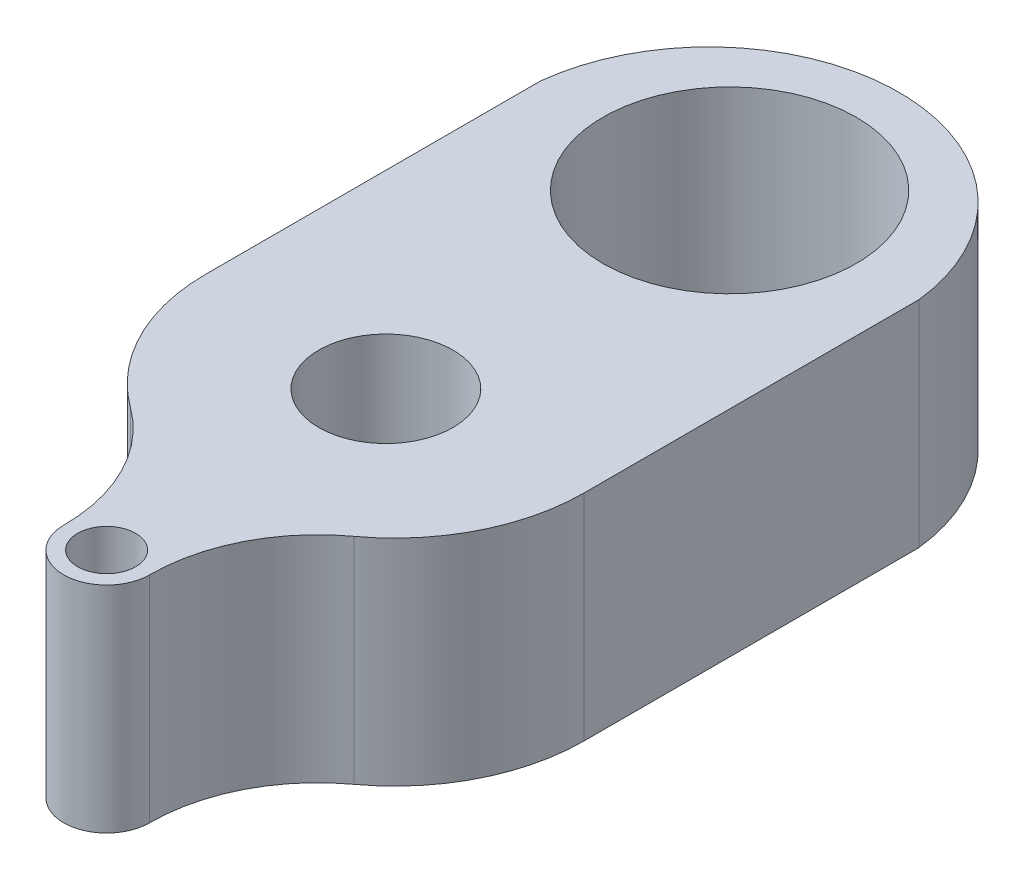
ISO-10303-21;
HEADER;
FILE_DESCRIPTION(('STEP AP214'),'2;1');
FILE_NAME('part.step','',(''),(''),'','','');
FILE_SCHEMA(('AUTOMOTIVE_DESIGN { 1 0 10303 214 1 1 1 1 }'));
ENDSEC;
DATA;
#1=APPLICATION_CONTEXT('core data for automotive mechanical design processes');
#2=APPLICATION_PROTOCOL_DEFINITION('international standard','automotive_design',2000,#1);
#3=PRODUCT_CONTEXT('',#1,'mechanical');
#4=PRODUCT('Part','Part','',(#3));
#5=PRODUCT_RELATED_PRODUCT_CATEGORY('part','',(#4));
#6=PRODUCT_DEFINITION_FORMATION('','',#4);
#7=PRODUCT_DEFINITION_CONTEXT('part definition',#1,'design');
#8=PRODUCT_DEFINITION('design','',#6,#7);
#9=PRODUCT_DEFINITION_SHAPE('','',#8);
#10=(LENGTH_UNIT() NAMED_UNIT(*) SI_UNIT(.MILLI.,.METRE.));
#11=(NAMED_UNIT(*) PLANE_ANGLE_UNIT() SI_UNIT($,.RADIAN.));
#12=(NAMED_UNIT(*) SI_UNIT($,.STERADIAN.) SOLID_ANGLE_UNIT());
#13=UNCERTAINTY_MEASURE_WITH_UNIT(LENGTH_MEASURE(1.E-05),#10,'distance_accuracy_value','');
#14=(GEOMETRIC_REPRESENTATION_CONTEXT(3) GLOBAL_UNCERTAINTY_ASSIGNED_CONTEXT((#13)) GLOBAL_UNIT_ASSIGNED_CONTEXT((#10,
#11,#12)) REPRESENTATION_CONTEXT('',''));
#15=CARTESIAN_POINT('',(0.,0.,0.));
#16=DIRECTION('',(0.,0.,1.));
#17=DIRECTION('',(1.,0.,0.));
#18=AXIS2_PLACEMENT_3D('',#15,#16,#17);
#19=CARTESIAN_POINT('',(0.,1.27,-1.70438291046017));
#20=DIRECTION('',(0.,-1.,0.));
#21=DIRECTION('',(0.,0.,-1.));
#22=AXIS2_PLACEMENT_3D('',#19,#20,#21);
#23=CYLINDRICAL_SURFACE('',#22,1.11918749999999);
#24=CARTESIAN_POINT('',(0.,0.,-1.70438291046017));
#25=DIRECTION('',(0.,1.,0.));
#26=DIRECTION('',(0.,0.,1.));
#27=AXIS2_PLACEMENT_3D('',#24,#25,#26);
#28=CIRCLE('',#27,1.11918749999999);
#29=CARTESIAN_POINT('',(-1.11918749999999,0.,-1.70438291046017));
#30=VERTEX_POINT('',#29);
#31=CARTESIAN_POINT('',(-0.660573073308267,0.,-0.800931818825275));
#32=VERTEX_POINT('',#31);
#33=EDGE_CURVE('E143',#30,#32,#28,.T.);
#34=ORIENTED_EDGE('',*,*,#33,.T.);
#35=DIRECTION('',(0.,-1.,0.));
#36=VECTOR('',#35,1.);
#37=CARTESIAN_POINT('',(-0.660573073308267,1.27,-0.800931818825275));
#38=LINE('',#37,#36);
#39=CARTESIAN_POINT('',(-0.660573073308267,1.27,-0.800931818825275));
#40=VERTEX_POINT('',#39);
#41=EDGE_CURVE('E11',#40,#32,#38,.T.);
#42=ORIENTED_EDGE('',*,*,#41,.F.);
#43=CARTESIAN_POINT('',(0.,1.27,-1.70438291046017));
#44=DIRECTION('',(0.,1.,0.));
#45=DIRECTION('',(0.,0.,1.));
#46=AXIS2_PLACEMENT_3D('',#43,#44,#45);
#47=CIRCLE('',#46,1.11918749999999);
#48=CARTESIAN_POINT('',(-1.11918749999999,1.27,-1.70438291046017));
#49=VERTEX_POINT('',#48);
#50=EDGE_CURVE('E189',#49,#40,#47,.T.);
#51=ORIENTED_EDGE('',*,*,#50,.F.);
#52=DIRECTION('',(0.,-1.,0.));
#53=VECTOR('',#52,1.);
#54=CARTESIAN_POINT('',(-1.11918749999999,1.27,-1.70438291046017));
#55=LINE('',#54,#53);
#56=EDGE_CURVE('E136',#49,#30,#55,.T.);
#57=ORIENTED_EDGE('',*,*,#56,.T.);
#58=EDGE_LOOP('',(#34,#42,#51,#57));
#59=FACE_BOUND('',#58,.T.);
#60=ADVANCED_FACE('F34',(#59),#23,.T.);
#61=CARTESIAN_POINT('',(-1.2461875,1.27,0.));
#62=DIRECTION('',(0.,-1.,0.));
#63=DIRECTION('',(0.,0.,-1.));
#64=AXIS2_PLACEMENT_3D('',#61,#62,#63);
#65=CYLINDRICAL_SURFACE('',#64,0.9921875);
#66=CARTESIAN_POINT('',(-1.2461875,0.,0.));
#67=DIRECTION('',(0.,1.,0.));
#68=DIRECTION('',(0.,0.,1.));
#69=AXIS2_PLACEMENT_3D('',#66,#67,#68);
#70=CIRCLE('',#69,0.9921875);
#71=CARTESIAN_POINT('',(-0.254,0.,0.));
#72=VERTEX_POINT('',#71);
#73=EDGE_CURVE('E146',#32,#72,#70,.F.);
#74=ORIENTED_EDGE('',*,*,#73,.T.);
#75=DIRECTION('',(0.,-1.,0.));
#76=VECTOR('',#75,1.);
#77=CARTESIAN_POINT('',(-0.254,1.27,0.));
#78=LINE('',#77,#76);
#79=CARTESIAN_POINT('',(-0.254,1.27,0.));
#80=VERTEX_POINT('',#79);
#81=EDGE_CURVE('E43',#80,#72,#78,.T.);
#82=ORIENTED_EDGE('',*,*,#81,.F.);
#83=CARTESIAN_POINT('',(-1.2461875,1.27,0.));
#84=DIRECTION('',(0.,1.,0.));
#85=DIRECTION('',(0.,0.,1.));
#86=AXIS2_PLACEMENT_3D('',#83,#84,#85);
#87=CIRCLE('',#86,0.9921875);
#88=EDGE_CURVE('E93',#40,#80,#87,.F.);
#89=ORIENTED_EDGE('',*,*,#88,.F.);
#90=ORIENTED_EDGE('',*,*,#41,.T.);
#91=EDGE_LOOP('',(#74,#82,#89,#90));
#92=FACE_BOUND('',#91,.T.);
#93=ADVANCED_FACE('F218',(#92),#65,.F.);
#94=CARTESIAN_POINT('',(0.,1.27,0.));
#95=DIRECTION('',(0.,-1.,0.));
#96=DIRECTION('',(0.,0.,-1.));
#97=AXIS2_PLACEMENT_3D('',#94,#95,#96);
#98=CYLINDRICAL_SURFACE('',#97,0.254);
#99=CARTESIAN_POINT('',(0.,0.,0.));
#100=DIRECTION('',(0.,1.,0.));
#101=DIRECTION('',(0.,0.,1.));
#102=AXIS2_PLACEMENT_3D('',#99,#100,#101);
#103=CIRCLE('',#102,0.254);
#104=CARTESIAN_POINT('',(0.254,0.,0.));
#105=VERTEX_POINT('',#104);
#106=EDGE_CURVE('E148',#72,#105,#103,.T.);
#107=ORIENTED_EDGE('',*,*,#106,.T.);
#108=DIRECTION('',(0.,-1.,0.));
#109=VECTOR('',#108,1.);
#110=CARTESIAN_POINT('',(0.254,1.27,0.));
#111=LINE('',#110,#109);
#112=CARTESIAN_POINT('',(0.254,1.27,0.));
#113=VERTEX_POINT('',#112);
#114=EDGE_CURVE('E169',#113,#105,#111,.T.);
#115=ORIENTED_EDGE('',*,*,#114,.F.);
#116=CARTESIAN_POINT('',(0.,1.27,0.));
#117=DIRECTION('',(0.,1.,0.));
#118=DIRECTION('',(0.,0.,1.));
#119=AXIS2_PLACEMENT_3D('',#116,#117,#118);
#120=CIRCLE('',#119,0.254);
#121=EDGE_CURVE('E176',#80,#113,#120,.T.);
#122=ORIENTED_EDGE('',*,*,#121,.F.);
#123=ORIENTED_EDGE('',*,*,#81,.T.);
#124=EDGE_LOOP('',(#107,#115,#122,#123));
#125=FACE_BOUND('',#124,.T.);
#126=ADVANCED_FACE('F174',(#125),#98,.T.);
#127=CARTESIAN_POINT('',(1.2461875,1.27,0.));
#128=DIRECTION('',(0.,-1.,0.));
#129=DIRECTION('',(0.,0.,-1.));
#130=AXIS2_PLACEMENT_3D('',#127,#128,#129);
#131=CYLINDRICAL_SURFACE('',#130,0.9921875);
#132=CARTESIAN_POINT('',(1.2461875,0.,0.));
#133=DIRECTION('',(0.,1.,0.));
#134=DIRECTION('',(0.,0.,1.));
#135=AXIS2_PLACEMENT_3D('',#132,#133,#134);
#136=CIRCLE('',#135,0.9921875);
#137=CARTESIAN_POINT('',(0.660573073308267,0.,-0.800931818825275));
#138=VERTEX_POINT('',#137);
#139=EDGE_CURVE('E151',#138,#105,#136,.T.);
#140=ORIENTED_EDGE('',*,*,#139,.F.);
#141=DIRECTION('',(0.,-1.,0.));
#142=VECTOR('',#141,1.);
#143=CARTESIAN_POINT('',(0.660573073308267,1.27,-0.800931818825275));
#144=LINE('',#143,#142);
#145=CARTESIAN_POINT('',(0.660573073308267,1.27,-0.800931818825275));
#146=VERTEX_POINT('',#145);
#147=EDGE_CURVE('E167',#146,#138,#144,.T.);
#148=ORIENTED_EDGE('',*,*,#147,.F.);
#149=CARTESIAN_POINT('',(1.2461875,1.27,0.));
#150=DIRECTION('',(0.,1.,0.));
#151=DIRECTION('',(0.,0.,1.));
#152=AXIS2_PLACEMENT_3D('',#149,#150,#151);
#153=CIRCLE('',#152,0.9921875);
#154=EDGE_CURVE('E128',#146,#113,#153,.T.);
#155=ORIENTED_EDGE('',*,*,#154,.T.);
#156=ORIENTED_EDGE('',*,*,#114,.T.);
#157=EDGE_LOOP('',(#140,#148,#155,#156));
#158=FACE_BOUND('',#157,.T.);
#159=ADVANCED_FACE('F184',(#158),#131,.F.);
#160=CARTESIAN_POINT('',(0.,1.27,-1.70438291046017));
#161=DIRECTION('',(0.,-1.,0.));
#162=DIRECTION('',(0.,0.,-1.));
#163=AXIS2_PLACEMENT_3D('',#160,#161,#162);
#164=CYLINDRICAL_SURFACE('',#163,1.11918749999999);
#165=CARTESIAN_POINT('',(0.,0.,-1.70438291046017));
#166=DIRECTION('',(0.,1.,0.));
#167=DIRECTION('',(0.,0.,1.));
#168=AXIS2_PLACEMENT_3D('',#165,#166,#167);
#169=CIRCLE('',#168,1.11918749999999);
#170=CARTESIAN_POINT('',(1.11918749999999,0.,-1.70438291046017));
#171=VERTEX_POINT('',#170);
#172=EDGE_CURVE('E154',#171,#138,#169,.F.);
#173=ORIENTED_EDGE('',*,*,#172,.F.);
#174=DIRECTION('',(0.,-1.,0.));
#175=VECTOR('',#174,1.);
#176=CARTESIAN_POINT('',(1.11918749999999,1.27,-1.70438291046017));
#177=LINE('',#176,#175);
#178=CARTESIAN_POINT('',(1.11918749999999,1.27,-1.70438291046017));
#179=VERTEX_POINT('',#178);
#180=EDGE_CURVE('E115',#179,#171,#177,.T.);
#181=ORIENTED_EDGE('',*,*,#180,.F.);
#182=CARTESIAN_POINT('',(0.,1.27,-1.70438291046017));
#183=DIRECTION('',(0.,1.,0.));
#184=DIRECTION('',(0.,0.,1.));
#185=AXIS2_PLACEMENT_3D('',#182,#183,#184);
#186=CIRCLE('',#185,1.11918749999999);
#187=EDGE_CURVE('E126',#179,#146,#186,.F.);
#188=ORIENTED_EDGE('',*,*,#187,.T.);
#189=ORIENTED_EDGE('',*,*,#147,.T.);
#190=EDGE_LOOP('',(#173,#181,#188,#189));
#191=FACE_BOUND('',#190,.T.);
#192=ADVANCED_FACE('F230',(#191),#164,.T.);
#193=CARTESIAN_POINT('',(1.11918749999999,1.27,0.));
#194=DIRECTION('',(1.,0.,0.));
#195=DIRECTION('',(0.,0.,-1.));
#196=AXIS2_PLACEMENT_3D('',#193,#194,#195);
#197=PLANE('',#196);
#198=DIRECTION('',(0.,0.,1.));
#199=VECTOR('',#198,1.);
#200=CARTESIAN_POINT('',(1.11918749999999,0.,0.));
#201=LINE('',#200,#199);
#202=CARTESIAN_POINT('',(1.11918749999999,0.,-3.68299999999993));
#203=VERTEX_POINT('',#202);
#204=EDGE_CURVE('E114',#203,#171,#201,.T.);
#205=ORIENTED_EDGE('',*,*,#204,.F.);
#206=DIRECTION('',(0.,-1.,0.));
#207=VECTOR('',#206,1.);
#208=CARTESIAN_POINT('',(1.11918749999999,1.27,-3.68299999999993));
#209=LINE('',#208,#207);
#210=CARTESIAN_POINT('',(1.11918749999999,1.27,-3.68299999999993));
#211=VERTEX_POINT('',#210);
#212=EDGE_CURVE('E108',#211,#203,#209,.T.);
#213=ORIENTED_EDGE('',*,*,#212,.F.);
#214=DIRECTION('',(0.,0.,1.));
#215=VECTOR('',#214,1.);
#216=CARTESIAN_POINT('',(1.11918749999999,1.27,0.));
#217=LINE('',#216,#215);
#218=EDGE_CURVE('E112',#211,#179,#217,.T.);
#219=ORIENTED_EDGE('',*,*,#218,.T.);
#220=ORIENTED_EDGE('',*,*,#180,.T.);
#221=EDGE_LOOP('',(#205,#213,#219,#220));
#222=FACE_BOUND('',#221,.T.);
#223=ADVANCED_FACE('F110',(#222),#197,.T.);
#224=CARTESIAN_POINT('',(0.,1.27,-3.56041963014244));
#225=DIRECTION('',(0.,-1.,0.));
#226=DIRECTION('',(0.,0.,-1.));
#227=AXIS2_PLACEMENT_3D('',#224,#225,#226);
#228=CYLINDRICAL_SURFACE('',#227,1.12588036985757);
#229=CARTESIAN_POINT('',(0.,0.,-3.56041963014244));
#230=DIRECTION('',(0.,1.,0.));
#231=DIRECTION('',(0.,0.,1.));
#232=AXIS2_PLACEMENT_3D('',#229,#230,#231);
#233=CIRCLE('',#232,1.12588036985757);
#234=CARTESIAN_POINT('',(-1.11918749999999,0.,-3.68299999999993));
#235=VERTEX_POINT('',#234);
#236=EDGE_CURVE('E79',#203,#235,#233,.T.);
#237=ORIENTED_EDGE('',*,*,#236,.T.);
#238=DIRECTION('',(0.,-1.,0.));
#239=VECTOR('',#238,1.);
#240=CARTESIAN_POINT('',(-1.11918749999999,1.27,-3.68299999999993));
#241=LINE('',#240,#239);
#242=CARTESIAN_POINT('',(-1.11918749999999,1.27,-3.68299999999993));
#243=VERTEX_POINT('',#242);
#244=EDGE_CURVE('E116',#243,#235,#241,.T.);
#245=ORIENTED_EDGE('',*,*,#244,.F.);
#246=CARTESIAN_POINT('',(0.,1.27,-3.56041963014244));
#247=DIRECTION('',(0.,1.,0.));
#248=DIRECTION('',(0.,0.,1.));
#249=AXIS2_PLACEMENT_3D('',#246,#247,#248);
#250=CIRCLE('',#249,1.12588036985757);
#251=EDGE_CURVE('E118',#211,#243,#250,.T.);
#252=ORIENTED_EDGE('',*,*,#251,.F.);
#253=ORIENTED_EDGE('',*,*,#212,.T.);
#254=EDGE_LOOP('',(#237,#245,#252,#253));
#255=FACE_BOUND('',#254,.T.);
#256=ADVANCED_FACE('F119',(#255),#228,.T.);
#257=CARTESIAN_POINT('',(-1.11918749999998,1.27,0.));
#258=DIRECTION('',(1.,0.,0.));
#259=DIRECTION('',(0.,0.,-1.));
#260=AXIS2_PLACEMENT_3D('',#257,#258,#259);
#261=PLANE('',#260);
#262=DIRECTION('',(0.,0.,1.));
#263=VECTOR('',#262,1.);
#264=CARTESIAN_POINT('',(-1.11918749999998,0.,0.));
#265=LINE('',#264,#263);
#266=EDGE_CURVE('E85',#235,#30,#265,.T.);
#267=ORIENTED_EDGE('',*,*,#266,.T.);
#268=ORIENTED_EDGE('',*,*,#56,.F.);
#269=DIRECTION('',(0.,0.,1.));
#270=VECTOR('',#269,1.);
#271=CARTESIAN_POINT('',(-1.11918749999998,1.27,0.));
#272=LINE('',#271,#270);
#273=EDGE_CURVE('E51',#243,#49,#272,.T.);
#274=ORIENTED_EDGE('',*,*,#273,.F.);
#275=ORIENTED_EDGE('',*,*,#244,.T.);
#276=EDGE_LOOP('',(#267,#268,#274,#275));
#277=FACE_BOUND('',#276,.T.);
#278=ADVANCED_FACE('F208',(#277),#261,.F.);
#279=CARTESIAN_POINT('',(0.,1.27,-3.683));
#280=DIRECTION('',(0.,-1.,0.));
#281=DIRECTION('',(0.,0.,-1.));
#282=AXIS2_PLACEMENT_3D('',#279,#280,#281);
#283=CYLINDRICAL_SURFACE('',#282,0.749300000000009);
#284=CARTESIAN_POINT('',(0.,1.27,-3.683));
#285=DIRECTION('',(0.,1.,0.));
#286=DIRECTION('',(0.,0.,1.));
#287=AXIS2_PLACEMENT_3D('',#284,#285,#286);
#288=CIRCLE('',#287,0.749300000000009);
#289=CARTESIAN_POINT('',(0.,1.27,-2.93369999999999));
#290=VERTEX_POINT('',#289);
#291=EDGE_CURVE('E191',#290,#290,#288,.T.);
#292=ORIENTED_EDGE('',*,*,#291,.T.);
#293=EDGE_LOOP('',(#292));
#294=FACE_BOUND('',#293,.T.);
#295=CARTESIAN_POINT('',(0.,0.,-3.683));
#296=DIRECTION('',(0.,1.,0.));
#297=DIRECTION('',(0.,0.,1.));
#298=AXIS2_PLACEMENT_3D('',#295,#296,#297);
#299=CIRCLE('',#298,0.749300000000009);
#300=CARTESIAN_POINT('',(0.,0.,-2.93369999999999));
#301=VERTEX_POINT('',#300);
#302=EDGE_CURVE('E140',#301,#301,#299,.T.);
#303=ORIENTED_EDGE('',*,*,#302,.F.);
#304=EDGE_LOOP('',(#303));
#305=FACE_BOUND('',#304,.T.);
#306=ADVANCED_FACE('F205',(#294,#305),#283,.F.);
#307=CARTESIAN_POINT('',(0.,1.27,-1.651));
#308=DIRECTION('',(0.,-1.,0.));
#309=DIRECTION('',(0.,0.,-1.));
#310=AXIS2_PLACEMENT_3D('',#307,#308,#309);
#311=CYLINDRICAL_SURFACE('',#310,0.396875);
#312=CARTESIAN_POINT('',(0.,1.27,-1.651));
#313=DIRECTION('',(0.,1.,0.));
#314=DIRECTION('',(0.,0.,1.));
#315=AXIS2_PLACEMENT_3D('',#312,#313,#314);
#316=CIRCLE('',#315,0.396875);
#317=CARTESIAN_POINT('',(0.,1.27,-1.254125));
#318=VERTEX_POINT('',#317);
#319=EDGE_CURVE('E163',#318,#318,#316,.T.);
#320=ORIENTED_EDGE('',*,*,#319,.T.);
#321=EDGE_LOOP('',(#320));
#322=FACE_BOUND('',#321,.T.);
#323=CARTESIAN_POINT('',(0.,0.,-1.651));
#324=DIRECTION('',(0.,1.,0.));
#325=DIRECTION('',(0.,0.,1.));
#326=AXIS2_PLACEMENT_3D('',#323,#324,#325);
#327=CIRCLE('',#326,0.396875);
#328=CARTESIAN_POINT('',(0.,0.,-1.254125));
#329=VERTEX_POINT('',#328);
#330=EDGE_CURVE('E137',#329,#329,#327,.T.);
#331=ORIENTED_EDGE('',*,*,#330,.F.);
#332=EDGE_LOOP('',(#331));
#333=FACE_BOUND('',#332,.T.);
#334=ADVANCED_FACE('F36',(#322,#333),#311,.F.);
#335=CARTESIAN_POINT('',(0.,1.27,0.));
#336=DIRECTION('',(0.,-1.,0.));
#337=DIRECTION('',(0.,0.,-1.));
#338=AXIS2_PLACEMENT_3D('',#335,#336,#337);
#339=CYLINDRICAL_SURFACE('',#338,0.17145);
#340=CARTESIAN_POINT('',(0.,1.27,0.));
#341=DIRECTION('',(0.,1.,0.));
#342=DIRECTION('',(0.,0.,1.));
#343=AXIS2_PLACEMENT_3D('',#340,#341,#342);
#344=CIRCLE('',#343,0.17145);
#345=CARTESIAN_POINT('',(0.,1.27,0.17145));
#346=VERTEX_POINT('',#345);
#347=EDGE_CURVE('E133',#346,#346,#344,.T.);
#348=ORIENTED_EDGE('',*,*,#347,.T.);
#349=EDGE_LOOP('',(#348));
#350=FACE_BOUND('',#349,.T.);
#351=CARTESIAN_POINT('',(0.,0.,0.));
#352=DIRECTION('',(0.,1.,0.));
#353=DIRECTION('',(0.,0.,1.));
#354=AXIS2_PLACEMENT_3D('',#351,#352,#353);
#355=CIRCLE('',#354,0.17145);
#356=CARTESIAN_POINT('',(0.,0.,0.17145));
#357=VERTEX_POINT('',#356);
#358=EDGE_CURVE('E160',#357,#357,#355,.T.);
#359=ORIENTED_EDGE('',*,*,#358,.F.);
#360=EDGE_LOOP('',(#359));
#361=FACE_BOUND('',#360,.T.);
#362=ADVANCED_FACE('F201',(#350,#361),#339,.F.);
#363=CARTESIAN_POINT('',(0.,1.27,0.));
#364=DIRECTION('',(0.,1.,0.));
#365=DIRECTION('',(0.,0.,1.));
#366=AXIS2_PLACEMENT_3D('',#363,#364,#365);
#367=PLANE('',#366);
#368=ORIENTED_EDGE('',*,*,#319,.F.);
#369=EDGE_LOOP('',(#368));
#370=FACE_BOUND('',#369,.T.);
#371=ORIENTED_EDGE('',*,*,#291,.F.);
#372=EDGE_LOOP('',(#371));
#373=FACE_BOUND('',#372,.T.);
#374=ORIENTED_EDGE('',*,*,#50,.T.);
#375=ORIENTED_EDGE('',*,*,#88,.T.);
#376=ORIENTED_EDGE('',*,*,#121,.T.);
#377=ORIENTED_EDGE('',*,*,#154,.F.);
#378=ORIENTED_EDGE('',*,*,#187,.F.);
#379=ORIENTED_EDGE('',*,*,#218,.F.);
#380=ORIENTED_EDGE('',*,*,#251,.T.);
#381=ORIENTED_EDGE('',*,*,#273,.T.);
#382=EDGE_LOOP('',(#374,#375,#376,#377,#378,#379,#380,#381));
#383=FACE_BOUND('',#382,.T.);
#384=ORIENTED_EDGE('',*,*,#347,.F.);
#385=EDGE_LOOP('',(#384));
#386=FACE_BOUND('',#385,.T.);
#387=ADVANCED_FACE('F122',(#370,#373,#383,#386),#367,.T.);
#388=CARTESIAN_POINT('',(0.,0.,0.));
#389=DIRECTION('',(0.,1.,0.));
#390=DIRECTION('',(0.,0.,1.));
#391=AXIS2_PLACEMENT_3D('',#388,#389,#390);
#392=PLANE('',#391);
#393=ORIENTED_EDGE('',*,*,#330,.T.);
#394=EDGE_LOOP('',(#393));
#395=FACE_BOUND('',#394,.T.);
#396=ORIENTED_EDGE('',*,*,#302,.T.);
#397=EDGE_LOOP('',(#396));
#398=FACE_BOUND('',#397,.T.);
#399=ORIENTED_EDGE('',*,*,#33,.F.);
#400=ORIENTED_EDGE('',*,*,#266,.F.);
#401=ORIENTED_EDGE('',*,*,#236,.F.);
#402=ORIENTED_EDGE('',*,*,#204,.T.);
#403=ORIENTED_EDGE('',*,*,#172,.T.);
#404=ORIENTED_EDGE('',*,*,#139,.T.);
#405=ORIENTED_EDGE('',*,*,#106,.F.);
#406=ORIENTED_EDGE('',*,*,#73,.F.);
#407=EDGE_LOOP('',(#399,#400,#401,#402,#403,#404,#405,#406));
#408=FACE_BOUND('',#407,.T.);
#409=ORIENTED_EDGE('',*,*,#358,.T.);
#410=EDGE_LOOP('',(#409));
#411=FACE_BOUND('',#410,.T.);
#412=ADVANCED_FACE('F179',(#395,#398,#408,#411),#392,.F.);
#413=CLOSED_SHELL('',(#60,#93,#126,#159,#192,#223,#256,#278,#306,#334,#362,#387,#412));
#414=MANIFOLD_SOLID_BREP('B2',#413);
#415=ADVANCED_BREP_SHAPE_REPRESENTATION('',(#18,#414),#14);
#416=SHAPE_DEFINITION_REPRESENTATION(#9,#415);
ENDSEC;
END-ISO-10303-21;
